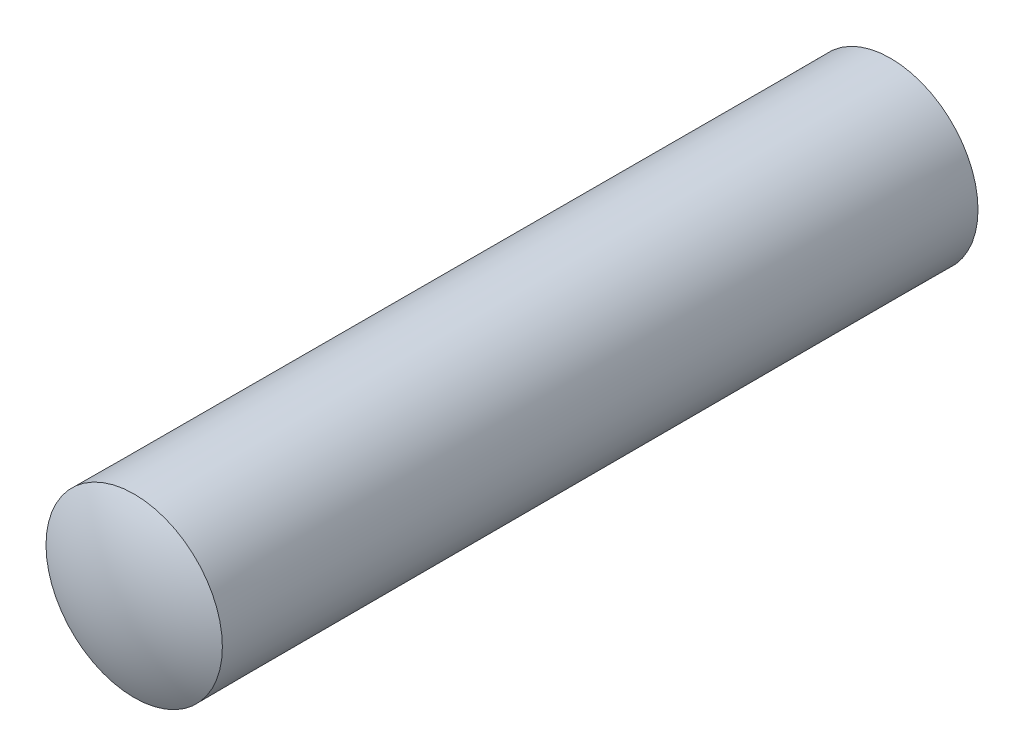
ISO-10303-21;
HEADER;
FILE_DESCRIPTION(('STEP AP214'),'2;1');
FILE_NAME('part.step','',(''),(''),'','','');
FILE_SCHEMA(('AUTOMOTIVE_DESIGN { 1 0 10303 214 1 1 1 1 }'));
ENDSEC;
DATA;
#1=APPLICATION_CONTEXT('core data for automotive mechanical design processes');
#2=APPLICATION_PROTOCOL_DEFINITION('international standard','automotive_design',2000,#1);
#3=PRODUCT_CONTEXT('',#1,'mechanical');
#4=PRODUCT('Part','Part','',(#3));
#5=PRODUCT_RELATED_PRODUCT_CATEGORY('part','',(#4));
#6=PRODUCT_DEFINITION_FORMATION('','',#4);
#7=PRODUCT_DEFINITION_CONTEXT('part definition',#1,'design');
#8=PRODUCT_DEFINITION('design','',#6,#7);
#9=PRODUCT_DEFINITION_SHAPE('','',#8);
#10=(LENGTH_UNIT() NAMED_UNIT(*) SI_UNIT(.MILLI.,.METRE.));
#11=(NAMED_UNIT(*) PLANE_ANGLE_UNIT() SI_UNIT($,.RADIAN.));
#12=(NAMED_UNIT(*) SI_UNIT($,.STERADIAN.) SOLID_ANGLE_UNIT());
#13=UNCERTAINTY_MEASURE_WITH_UNIT(LENGTH_MEASURE(1.E-05),#10,'distance_accuracy_value','');
#14=(GEOMETRIC_REPRESENTATION_CONTEXT(3) GLOBAL_UNCERTAINTY_ASSIGNED_CONTEXT((#13)) GLOBAL_UNIT_ASSIGNED_CONTEXT((#10,
#11,#12)) REPRESENTATION_CONTEXT('',''));
#15=CARTESIAN_POINT('',(0.,0.,0.));
#16=DIRECTION('',(0.,0.,1.));
#17=DIRECTION('',(1.,0.,0.));
#18=AXIS2_PLACEMENT_3D('',#15,#16,#17);
#19=CARTESIAN_POINT('',(0.,3.05311331771918E-13,12.));
#20=DIRECTION('',(0.,0.,-1.));
#21=DIRECTION('',(0.,1.,0.));
#22=AXIS2_PLACEMENT_3D('',#19,#20,#21);
#23=SPHERICAL_SURFACE('',#22,12.);
#24=CARTESIAN_POINT('',(0.,0.,1.6057729674168));
#25=DIRECTION('',(0.,0.,-1.));
#26=DIRECTION('',(-1.,0.,0.));
#27=AXIS2_PLACEMENT_3D('',#24,#25,#26);
#28=CIRCLE('',#27,5.99666944187492);
#29=CARTESIAN_POINT('',(-5.99666944187492,0.,1.60577296741681));
#30=VERTEX_POINT('',#29);
#31=EDGE_CURVE('E32',#30,#30,#28,.T.);
#32=ORIENTED_EDGE('',*,*,#31,.T.);
#33=EDGE_LOOP('',(#32));
#34=FACE_BOUND('',#33,.T.);
#35=ADVANCED_FACE('F25',(#34),#23,.T.);
#36=CARTESIAN_POINT('',(0.,0.,42.10546875));
#37=DIRECTION('',(0.,0.,-1.));
#38=DIRECTION('',(0.,-1.,0.));
#39=AXIS2_PLACEMENT_3D('',#36,#37,#38);
#40=SPHERICAL_SURFACE('',#39,12.89453125);
#41=CARTESIAN_POINT('',(0.,3.05311331771918E-13,53.4929237763359));
#42=DIRECTION('',(0.,0.,-1.));
#43=DIRECTION('',(-1.,0.,0.));
#44=AXIS2_PLACEMENT_3D('',#41,#42,#43);
#45=CIRCLE('',#44,6.04936394841668);
#46=CARTESIAN_POINT('',(-6.04936394841658,3.04975524614925E-13,53.4929237763359));
#47=VERTEX_POINT('',#46);
#48=EDGE_CURVE('E12',#47,#47,#45,.T.);
#49=ORIENTED_EDGE('',*,*,#48,.F.);
#50=EDGE_LOOP('',(#49));
#51=FACE_BOUND('',#50,.T.);
#52=ADVANCED_FACE('F48',(#51),#40,.T.);
#53=CARTESIAN_POINT('',(0.,3.05311331771918E-13,53.4929237763359));
#54=DIRECTION('',(0.,0.,1.));
#55=DIRECTION('',(1.,0.,0.));
#56=AXIS2_PLACEMENT_3D('',#53,#54,#55);
#57=CONICAL_SURFACE('',#56,6.04936394841668,0.00101555949025066);
#58=ORIENTED_EDGE('',*,*,#31,.F.);
#59=EDGE_LOOP('',(#58));
#60=FACE_BOUND('',#59,.T.);
#61=ORIENTED_EDGE('',*,*,#48,.T.);
#62=EDGE_LOOP('',(#61));
#63=FACE_BOUND('',#62,.T.);
#64=ADVANCED_FACE('F46',(#60,#63),#57,.T.);
#65=CLOSED_SHELL('',(#35,#52,#64));
#66=MANIFOLD_SOLID_BREP('B1',#65);
#67=ADVANCED_BREP_SHAPE_REPRESENTATION('',(#18,#66),#14);
#68=SHAPE_DEFINITION_REPRESENTATION(#9,#67);
ENDSEC;
END-ISO-10303-21;
